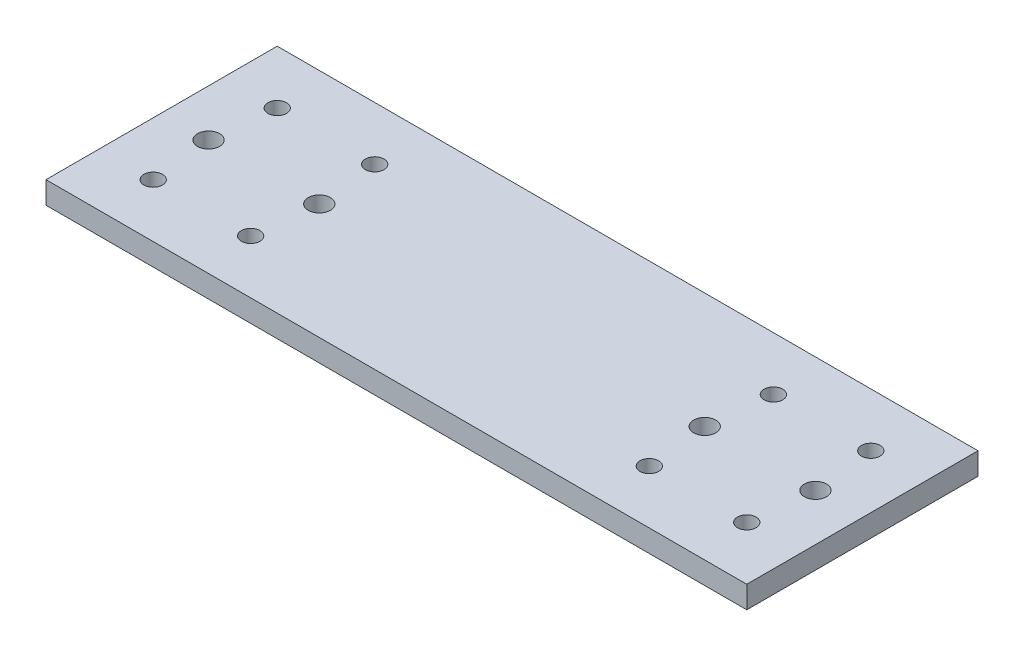
ISO-10303-21;
HEADER;
FILE_DESCRIPTION(('STEP AP214'),'2;1');
FILE_NAME('part.step','',(''),(''),'','','');
FILE_SCHEMA(('AUTOMOTIVE_DESIGN { 1 0 10303 214 1 1 1 1 }'));
ENDSEC;
DATA;
#1=APPLICATION_CONTEXT('core data for automotive mechanical design processes');
#2=APPLICATION_PROTOCOL_DEFINITION('international standard','automotive_design',2000,#1);
#3=PRODUCT_CONTEXT('',#1,'mechanical');
#4=PRODUCT('Part','Part','',(#3));
#5=PRODUCT_RELATED_PRODUCT_CATEGORY('part','',(#4));
#6=PRODUCT_DEFINITION_FORMATION('','',#4);
#7=PRODUCT_DEFINITION_CONTEXT('part definition',#1,'design');
#8=PRODUCT_DEFINITION('design','',#6,#7);
#9=PRODUCT_DEFINITION_SHAPE('','',#8);
#10=(LENGTH_UNIT() NAMED_UNIT(*) SI_UNIT(.MILLI.,.METRE.));
#11=(NAMED_UNIT(*) PLANE_ANGLE_UNIT() SI_UNIT($,.RADIAN.));
#12=(NAMED_UNIT(*) SI_UNIT($,.STERADIAN.) SOLID_ANGLE_UNIT());
#13=UNCERTAINTY_MEASURE_WITH_UNIT(LENGTH_MEASURE(1.E-05),#10,'distance_accuracy_value','');
#14=(GEOMETRIC_REPRESENTATION_CONTEXT(3) GLOBAL_UNCERTAINTY_ASSIGNED_CONTEXT((#13)) GLOBAL_UNIT_ASSIGNED_CONTEXT((#10,
#11,#12)) REPRESENTATION_CONTEXT('',''));
#15=CARTESIAN_POINT('',(0.,0.,0.));
#16=DIRECTION('',(0.,0.,1.));
#17=DIRECTION('',(1.,0.,0.));
#18=AXIS2_PLACEMENT_3D('',#15,#16,#17);
#19=CARTESIAN_POINT('',(0.,5.,0.));
#20=DIRECTION('',(0.,1.,0.));
#21=DIRECTION('',(0.,0.,1.));
#22=AXIS2_PLACEMENT_3D('',#19,#20,#21);
#23=PLANE('',#22);
#24=CARTESIAN_POINT('',(99.5000003054737,5.,-1.59594559789866E-13));
#25=DIRECTION('',(0.,-1.,0.));
#26=DIRECTION('',(0.,0.,-1.));
#27=AXIS2_PLACEMENT_3D('',#24,#25,#26);
#28=CIRCLE('',#27,2.50000000000003);
#29=CARTESIAN_POINT('',(99.5000003054737,5.,-2.50000000000019));
#30=VERTEX_POINT('',#29);
#31=EDGE_CURVE('E310',#30,#30,#28,.T.);
#32=ORIENTED_EDGE('',*,*,#31,.T.);
#33=EDGE_LOOP('',(#32));
#34=FACE_BOUND('',#33,.T.);
#35=CARTESIAN_POINT('',(-12.5,5.,1.31838984174237E-13));
#36=DIRECTION('',(0.,1.,0.));
#37=DIRECTION('',(0.,0.,1.));
#38=AXIS2_PLACEMENT_3D('',#35,#36,#37);
#39=CIRCLE('',#38,2.49999999999991);
#40=CARTESIAN_POINT('',(-12.5,5.,2.50000000000004));
#41=VERTEX_POINT('',#40);
#42=EDGE_CURVE('E305',#41,#41,#39,.T.);
#43=ORIENTED_EDGE('',*,*,#42,.F.);
#44=EDGE_LOOP('',(#43));
#45=FACE_BOUND('',#44,.T.);
#46=CARTESIAN_POINT('',(12.5,5.,-1.59594559789866E-13));
#47=DIRECTION('',(0.,1.,0.));
#48=DIRECTION('',(0.,0.,1.));
#49=AXIS2_PLACEMENT_3D('',#46,#47,#48);
#50=CIRCLE('',#49,2.50000000000003);
#51=CARTESIAN_POINT('',(12.5,5.,2.49999999999987));
#52=VERTEX_POINT('',#51);
#53=EDGE_CURVE('E181',#52,#52,#50,.T.);
#54=ORIENTED_EDGE('',*,*,#53,.F.);
#55=EDGE_LOOP('',(#54));
#56=FACE_BOUND('',#55,.T.);
#57=CARTESIAN_POINT('',(101.000000305474,5.,-14.));
#58=DIRECTION('',(0.,1.,0.));
#59=DIRECTION('',(0.,0.,1.));
#60=AXIS2_PLACEMENT_3D('',#57,#58,#59);
#61=CIRCLE('',#60,2.10000000000002);
#62=CARTESIAN_POINT('',(101.000000305474,5.,-11.9));
#63=VERTEX_POINT('',#62);
#64=EDGE_CURVE('E171',#63,#63,#61,.F.);
#65=ORIENTED_EDGE('',*,*,#64,.T.);
#66=EDGE_LOOP('',(#65));
#67=FACE_BOUND('',#66,.T.);
#68=CARTESIAN_POINT('',(123.000000305474,5.,14.));
#69=DIRECTION('',(0.,1.,0.));
#70=DIRECTION('',(0.,0.,1.));
#71=AXIS2_PLACEMENT_3D('',#68,#69,#70);
#72=CIRCLE('',#71,2.09999999999998);
#73=CARTESIAN_POINT('',(123.000000305474,5.,16.1));
#74=VERTEX_POINT('',#73);
#75=EDGE_CURVE('E253',#74,#74,#72,.F.);
#76=ORIENTED_EDGE('',*,*,#75,.T.);
#77=EDGE_LOOP('',(#76));
#78=FACE_BOUND('',#77,.T.);
#79=CARTESIAN_POINT('',(-11.,5.,14.));
#80=DIRECTION('',(0.,1.,0.));
#81=DIRECTION('',(0.,0.,1.));
#82=AXIS2_PLACEMENT_3D('',#79,#80,#81);
#83=CIRCLE('',#82,2.1);
#84=CARTESIAN_POINT('',(-11.,5.,16.1));
#85=VERTEX_POINT('',#84);
#86=EDGE_CURVE('E277',#85,#85,#83,.T.);
#87=ORIENTED_EDGE('',*,*,#86,.F.);
#88=EDGE_LOOP('',(#87));
#89=FACE_BOUND('',#88,.T.);
#90=CARTESIAN_POINT('',(11.,5.,14.));
#91=DIRECTION('',(0.,1.,0.));
#92=DIRECTION('',(0.,0.,1.));
#93=AXIS2_PLACEMENT_3D('',#90,#91,#92);
#94=CIRCLE('',#93,2.1);
#95=CARTESIAN_POINT('',(11.,5.,16.1));
#96=VERTEX_POINT('',#95);
#97=EDGE_CURVE('E282',#96,#96,#94,.T.);
#98=ORIENTED_EDGE('',*,*,#97,.F.);
#99=EDGE_LOOP('',(#98));
#100=FACE_BOUND('',#99,.T.);
#101=CARTESIAN_POINT('',(11.,5.,-14.));
#102=DIRECTION('',(0.,1.,0.));
#103=DIRECTION('',(0.,0.,1.));
#104=AXIS2_PLACEMENT_3D('',#101,#102,#103);
#105=CIRCLE('',#104,2.1);
#106=CARTESIAN_POINT('',(11.,5.,-11.9));
#107=VERTEX_POINT('',#106);
#108=EDGE_CURVE('E291',#107,#107,#105,.T.);
#109=ORIENTED_EDGE('',*,*,#108,.F.);
#110=EDGE_LOOP('',(#109));
#111=FACE_BOUND('',#110,.T.);
#112=CARTESIAN_POINT('',(-11.,5.,-14.));
#113=DIRECTION('',(0.,1.,0.));
#114=DIRECTION('',(0.,0.,1.));
#115=AXIS2_PLACEMENT_3D('',#112,#113,#114);
#116=CIRCLE('',#115,2.1);
#117=CARTESIAN_POINT('',(-11.,5.,-11.9));
#118=VERTEX_POINT('',#117);
#119=EDGE_CURVE('E115',#118,#118,#116,.T.);
#120=ORIENTED_EDGE('',*,*,#119,.F.);
#121=EDGE_LOOP('',(#120));
#122=FACE_BOUND('',#121,.T.);
#123=DIRECTION('',(0.,0.,1.));
#124=VECTOR('',#123,1.);
#125=CARTESIAN_POINT('',(135.100000305474,5.,0.));
#126=LINE('',#125,#124);
#127=CARTESIAN_POINT('',(135.100000305474,5.,-26.1));
#128=VERTEX_POINT('',#127);
#129=CARTESIAN_POINT('',(135.100000305474,5.,26.1));
#130=VERTEX_POINT('',#129);
#131=EDGE_CURVE('E111',#128,#130,#126,.T.);
#132=ORIENTED_EDGE('',*,*,#131,.F.);
#133=DIRECTION('',(1.,0.,0.));
#134=VECTOR('',#133,1.);
#135=CARTESIAN_POINT('',(0.,5.,-26.1));
#136=LINE('',#135,#134);
#137=CARTESIAN_POINT('',(-23.1,5.,-26.1));
#138=VERTEX_POINT('',#137);
#139=EDGE_CURVE('E97',#138,#128,#136,.T.);
#140=ORIENTED_EDGE('',*,*,#139,.F.);
#141=DIRECTION('',(0.,0.,1.));
#142=VECTOR('',#141,1.);
#143=CARTESIAN_POINT('',(-23.1,5.,0.));
#144=LINE('',#143,#142);
#145=CARTESIAN_POINT('',(-23.1,5.,26.1));
#146=VERTEX_POINT('',#145);
#147=EDGE_CURVE('E106',#138,#146,#144,.T.);
#148=ORIENTED_EDGE('',*,*,#147,.T.);
#149=DIRECTION('',(1.,0.,0.));
#150=VECTOR('',#149,1.);
#151=CARTESIAN_POINT('',(0.,5.,26.1));
#152=LINE('',#151,#150);
#153=EDGE_CURVE('E64',#146,#130,#152,.T.);
#154=ORIENTED_EDGE('',*,*,#153,.T.);
#155=EDGE_LOOP('',(#132,#140,#148,#154));
#156=FACE_BOUND('',#155,.T.);
#157=CARTESIAN_POINT('',(101.000000305474,5.,14.));
#158=DIRECTION('',(0.,1.,0.));
#159=DIRECTION('',(0.,0.,1.));
#160=AXIS2_PLACEMENT_3D('',#157,#158,#159);
#161=CIRCLE('',#160,2.1);
#162=CARTESIAN_POINT('',(101.000000305474,5.,16.1));
#163=VERTEX_POINT('',#162);
#164=EDGE_CURVE('E121',#163,#163,#161,.F.);
#165=ORIENTED_EDGE('',*,*,#164,.T.);
#166=EDGE_LOOP('',(#165));
#167=FACE_BOUND('',#166,.T.);
#168=CARTESIAN_POINT('',(123.000000305474,5.,-14.));
#169=DIRECTION('',(0.,1.,0.));
#170=DIRECTION('',(0.,0.,1.));
#171=AXIS2_PLACEMENT_3D('',#168,#169,#170);
#172=CIRCLE('',#171,2.09999999999998);
#173=CARTESIAN_POINT('',(123.000000305474,5.,-11.9));
#174=VERTEX_POINT('',#173);
#175=EDGE_CURVE('E125',#174,#174,#172,.F.);
#176=ORIENTED_EDGE('',*,*,#175,.T.);
#177=EDGE_LOOP('',(#176));
#178=FACE_BOUND('',#177,.T.);
#179=CARTESIAN_POINT('',(124.500000305474,5.,1.31838984174237E-13));
#180=DIRECTION('',(0.,-1.,0.));
#181=DIRECTION('',(0.,0.,-1.));
#182=AXIS2_PLACEMENT_3D('',#179,#180,#181);
#183=CIRCLE('',#182,2.49999999999991);
#184=CARTESIAN_POINT('',(124.500000305474,5.,-2.49999999999978));
#185=VERTEX_POINT('',#184);
#186=EDGE_CURVE('E306',#185,#185,#183,.T.);
#187=ORIENTED_EDGE('',*,*,#186,.T.);
#188=EDGE_LOOP('',(#187));
#189=FACE_BOUND('',#188,.T.);
#190=ADVANCED_FACE('F44',(#34,#45,#56,#67,#78,#89,#100,#111,#122,#156,#167,#178,#189),#23,.T.);
#191=CARTESIAN_POINT('',(0.,0.,0.));
#192=DIRECTION('',(0.,1.,0.));
#193=DIRECTION('',(0.,0.,1.));
#194=AXIS2_PLACEMENT_3D('',#191,#192,#193);
#195=PLANE('',#194);
#196=CARTESIAN_POINT('',(-12.5,0.,1.31838984174237E-13));
#197=DIRECTION('',(0.,1.,0.));
#198=DIRECTION('',(0.,0.,1.));
#199=AXIS2_PLACEMENT_3D('',#196,#197,#198);
#200=CIRCLE('',#199,2.49999999999991);
#201=CARTESIAN_POINT('',(-12.5,0.,2.50000000000004));
#202=VERTEX_POINT('',#201);
#203=EDGE_CURVE('E180',#202,#202,#200,.T.);
#204=ORIENTED_EDGE('',*,*,#203,.T.);
#205=EDGE_LOOP('',(#204));
#206=FACE_BOUND('',#205,.T.);
#207=CARTESIAN_POINT('',(12.5,0.,-1.59594559789866E-13));
#208=DIRECTION('',(0.,1.,0.));
#209=DIRECTION('',(0.,0.,1.));
#210=AXIS2_PLACEMENT_3D('',#207,#208,#209);
#211=CIRCLE('',#210,2.50000000000003);
#212=CARTESIAN_POINT('',(12.5,0.,2.49999999999987));
#213=VERTEX_POINT('',#212);
#214=EDGE_CURVE('E176',#213,#213,#211,.T.);
#215=ORIENTED_EDGE('',*,*,#214,.T.);
#216=EDGE_LOOP('',(#215));
#217=FACE_BOUND('',#216,.T.);
#218=CARTESIAN_POINT('',(101.000000305474,0.,-14.));
#219=DIRECTION('',(0.,1.,0.));
#220=DIRECTION('',(0.,0.,1.));
#221=AXIS2_PLACEMENT_3D('',#218,#219,#220);
#222=CIRCLE('',#221,2.10000000000002);
#223=CARTESIAN_POINT('',(101.000000305474,0.,-11.9));
#224=VERTEX_POINT('',#223);
#225=EDGE_CURVE('E129',#224,#224,#222,.F.);
#226=ORIENTED_EDGE('',*,*,#225,.F.);
#227=EDGE_LOOP('',(#226));
#228=FACE_BOUND('',#227,.T.);
#229=CARTESIAN_POINT('',(123.000000305474,0.,14.));
#230=DIRECTION('',(0.,1.,0.));
#231=DIRECTION('',(0.,0.,1.));
#232=AXIS2_PLACEMENT_3D('',#229,#230,#231);
#233=CIRCLE('',#232,2.09999999999998);
#234=CARTESIAN_POINT('',(123.000000305474,0.,16.1));
#235=VERTEX_POINT('',#234);
#236=EDGE_CURVE('E133',#235,#235,#233,.F.);
#237=ORIENTED_EDGE('',*,*,#236,.F.);
#238=EDGE_LOOP('',(#237));
#239=FACE_BOUND('',#238,.T.);
#240=CARTESIAN_POINT('',(-11.,0.,14.));
#241=DIRECTION('',(0.,1.,0.));
#242=DIRECTION('',(0.,0.,1.));
#243=AXIS2_PLACEMENT_3D('',#240,#241,#242);
#244=CIRCLE('',#243,2.1);
#245=CARTESIAN_POINT('',(-11.,0.,16.1));
#246=VERTEX_POINT('',#245);
#247=EDGE_CURVE('E137',#246,#246,#244,.T.);
#248=ORIENTED_EDGE('',*,*,#247,.T.);
#249=EDGE_LOOP('',(#248));
#250=FACE_BOUND('',#249,.T.);
#251=CARTESIAN_POINT('',(11.,0.,14.));
#252=DIRECTION('',(0.,1.,0.));
#253=DIRECTION('',(0.,0.,1.));
#254=AXIS2_PLACEMENT_3D('',#251,#252,#253);
#255=CIRCLE('',#254,2.1);
#256=CARTESIAN_POINT('',(11.,0.,16.1));
#257=VERTEX_POINT('',#256);
#258=EDGE_CURVE('E141',#257,#257,#255,.T.);
#259=ORIENTED_EDGE('',*,*,#258,.T.);
#260=EDGE_LOOP('',(#259));
#261=FACE_BOUND('',#260,.T.);
#262=CARTESIAN_POINT('',(11.,0.,-14.));
#263=DIRECTION('',(0.,1.,0.));
#264=DIRECTION('',(0.,0.,1.));
#265=AXIS2_PLACEMENT_3D('',#262,#263,#264);
#266=CIRCLE('',#265,2.1);
#267=CARTESIAN_POINT('',(11.,0.,-11.9));
#268=VERTEX_POINT('',#267);
#269=EDGE_CURVE('E145',#268,#268,#266,.T.);
#270=ORIENTED_EDGE('',*,*,#269,.T.);
#271=EDGE_LOOP('',(#270));
#272=FACE_BOUND('',#271,.T.);
#273=CARTESIAN_POINT('',(-11.,0.,-14.));
#274=DIRECTION('',(0.,1.,0.));
#275=DIRECTION('',(0.,0.,1.));
#276=AXIS2_PLACEMENT_3D('',#273,#274,#275);
#277=CIRCLE('',#276,2.1);
#278=CARTESIAN_POINT('',(-11.,0.,-11.9));
#279=VERTEX_POINT('',#278);
#280=EDGE_CURVE('E149',#279,#279,#277,.T.);
#281=ORIENTED_EDGE('',*,*,#280,.T.);
#282=EDGE_LOOP('',(#281));
#283=FACE_BOUND('',#282,.T.);
#284=DIRECTION('',(0.,0.,1.));
#285=VECTOR('',#284,1.);
#286=CARTESIAN_POINT('',(135.100000305474,0.,0.));
#287=LINE('',#286,#285);
#288=CARTESIAN_POINT('',(135.100000305474,0.,-26.1));
#289=VERTEX_POINT('',#288);
#290=CARTESIAN_POINT('',(135.100000305474,0.,26.1));
#291=VERTEX_POINT('',#290);
#292=EDGE_CURVE('E153',#289,#291,#287,.T.);
#293=ORIENTED_EDGE('',*,*,#292,.T.);
#294=DIRECTION('',(1.,0.,0.));
#295=VECTOR('',#294,1.);
#296=CARTESIAN_POINT('',(0.,0.,26.1));
#297=LINE('',#296,#295);
#298=CARTESIAN_POINT('',(-23.1,0.,26.1));
#299=VERTEX_POINT('',#298);
#300=EDGE_CURVE('E80',#299,#291,#297,.T.);
#301=ORIENTED_EDGE('',*,*,#300,.F.);
#302=DIRECTION('',(0.,0.,1.));
#303=VECTOR('',#302,1.);
#304=CARTESIAN_POINT('',(-23.1,0.,0.));
#305=LINE('',#304,#303);
#306=CARTESIAN_POINT('',(-23.1,0.,-26.1));
#307=VERTEX_POINT('',#306);
#308=EDGE_CURVE('E158',#307,#299,#305,.T.);
#309=ORIENTED_EDGE('',*,*,#308,.F.);
#310=DIRECTION('',(1.,0.,0.));
#311=VECTOR('',#310,1.);
#312=CARTESIAN_POINT('',(0.,0.,-26.1));
#313=LINE('',#312,#311);
#314=EDGE_CURVE('E99',#307,#289,#313,.T.);
#315=ORIENTED_EDGE('',*,*,#314,.T.);
#316=EDGE_LOOP('',(#293,#301,#309,#315));
#317=FACE_BOUND('',#316,.T.);
#318=CARTESIAN_POINT('',(101.000000305474,0.,14.));
#319=DIRECTION('',(0.,1.,0.));
#320=DIRECTION('',(0.,0.,1.));
#321=AXIS2_PLACEMENT_3D('',#318,#319,#320);
#322=CIRCLE('',#321,2.1);
#323=CARTESIAN_POINT('',(101.000000305474,0.,16.1));
#324=VERTEX_POINT('',#323);
#325=EDGE_CURVE('E163',#324,#324,#322,.F.);
#326=ORIENTED_EDGE('',*,*,#325,.F.);
#327=EDGE_LOOP('',(#326));
#328=FACE_BOUND('',#327,.T.);
#329=CARTESIAN_POINT('',(123.000000305474,0.,-14.));
#330=DIRECTION('',(0.,1.,0.));
#331=DIRECTION('',(0.,0.,1.));
#332=AXIS2_PLACEMENT_3D('',#329,#330,#331);
#333=CIRCLE('',#332,2.09999999999998);
#334=CARTESIAN_POINT('',(123.000000305474,0.,-11.9));
#335=VERTEX_POINT('',#334);
#336=EDGE_CURVE('E167',#335,#335,#333,.F.);
#337=ORIENTED_EDGE('',*,*,#336,.F.);
#338=EDGE_LOOP('',(#337));
#339=FACE_BOUND('',#338,.T.);
#340=CARTESIAN_POINT('',(99.5000003054737,0.,-1.59594559789866E-13));
#341=DIRECTION('',(0.,1.,0.));
#342=DIRECTION('',(0.,0.,1.));
#343=AXIS2_PLACEMENT_3D('',#340,#341,#342);
#344=CIRCLE('',#343,2.50000000000003);
#345=CARTESIAN_POINT('',(99.5000003054737,0.,2.49999999999987));
#346=VERTEX_POINT('',#345);
#347=EDGE_CURVE('E184',#346,#346,#344,.F.);
#348=ORIENTED_EDGE('',*,*,#347,.F.);
#349=EDGE_LOOP('',(#348));
#350=FACE_BOUND('',#349,.T.);
#351=CARTESIAN_POINT('',(124.500000305474,0.,1.31838984174237E-13));
#352=DIRECTION('',(0.,1.,0.));
#353=DIRECTION('',(0.,0.,1.));
#354=AXIS2_PLACEMENT_3D('',#351,#352,#353);
#355=CIRCLE('',#354,2.49999999999991);
#356=CARTESIAN_POINT('',(124.500000305474,0.,2.50000000000004));
#357=VERTEX_POINT('',#356);
#358=EDGE_CURVE('E48',#357,#357,#355,.F.);
#359=ORIENTED_EDGE('',*,*,#358,.F.);
#360=EDGE_LOOP('',(#359));
#361=FACE_BOUND('',#360,.T.);
#362=ADVANCED_FACE('F195',(#206,#217,#228,#239,#250,#261,#272,#283,#317,#328,#339,#350,#361),
#195,.F.);
#363=CARTESIAN_POINT('',(135.100000305474,5.,0.));
#364=DIRECTION('',(1.,0.,0.));
#365=DIRECTION('',(0.,0.,-1.));
#366=AXIS2_PLACEMENT_3D('',#363,#364,#365);
#367=PLANE('',#366);
#368=ORIENTED_EDGE('',*,*,#292,.F.);
#369=DIRECTION('',(0.,-1.,0.));
#370=VECTOR('',#369,1.);
#371=CARTESIAN_POINT('',(135.100000305474,5.,-26.1));
#372=LINE('',#371,#370);
#373=EDGE_CURVE('E11',#128,#289,#372,.T.);
#374=ORIENTED_EDGE('',*,*,#373,.F.);
#375=ORIENTED_EDGE('',*,*,#131,.T.);
#376=DIRECTION('',(0.,-1.,0.));
#377=VECTOR('',#376,1.);
#378=CARTESIAN_POINT('',(135.100000305474,5.,26.1));
#379=LINE('',#378,#377);
#380=EDGE_CURVE('E87',#130,#291,#379,.T.);
#381=ORIENTED_EDGE('',*,*,#380,.T.);
#382=EDGE_LOOP('',(#368,#374,#375,#381));
#383=FACE_BOUND('',#382,.T.);
#384=ADVANCED_FACE('F197',(#383),#367,.T.);
#385=CARTESIAN_POINT('',(0.,5.,-26.1));
#386=DIRECTION('',(0.,0.,-1.));
#387=DIRECTION('',(-1.,0.,0.));
#388=AXIS2_PLACEMENT_3D('',#385,#386,#387);
#389=PLANE('',#388);
#390=ORIENTED_EDGE('',*,*,#314,.F.);
#391=DIRECTION('',(0.,-1.,0.));
#392=VECTOR('',#391,1.);
#393=CARTESIAN_POINT('',(-23.1,5.,-26.1));
#394=LINE('',#393,#392);
#395=EDGE_CURVE('E55',#138,#307,#394,.T.);
#396=ORIENTED_EDGE('',*,*,#395,.F.);
#397=ORIENTED_EDGE('',*,*,#139,.T.);
#398=ORIENTED_EDGE('',*,*,#373,.T.);
#399=EDGE_LOOP('',(#390,#396,#397,#398));
#400=FACE_BOUND('',#399,.T.);
#401=ADVANCED_FACE('F95',(#400),#389,.T.);
#402=CARTESIAN_POINT('',(-23.1,5.,0.));
#403=DIRECTION('',(1.,0.,0.));
#404=DIRECTION('',(0.,0.,-1.));
#405=AXIS2_PLACEMENT_3D('',#402,#403,#404);
#406=PLANE('',#405);
#407=ORIENTED_EDGE('',*,*,#308,.T.);
#408=DIRECTION('',(0.,-1.,0.));
#409=VECTOR('',#408,1.);
#410=CARTESIAN_POINT('',(-23.1,5.,26.1));
#411=LINE('',#410,#409);
#412=EDGE_CURVE('E103',#146,#299,#411,.T.);
#413=ORIENTED_EDGE('',*,*,#412,.F.);
#414=ORIENTED_EDGE('',*,*,#147,.F.);
#415=ORIENTED_EDGE('',*,*,#395,.T.);
#416=EDGE_LOOP('',(#407,#413,#414,#415));
#417=FACE_BOUND('',#416,.T.);
#418=ADVANCED_FACE('F107',(#417),#406,.F.);
#419=CARTESIAN_POINT('',(101.000000305474,5.,14.));
#420=DIRECTION('',(0.,-1.,0.));
#421=DIRECTION('',(0.,0.,-1.));
#422=AXIS2_PLACEMENT_3D('',#419,#420,#421);
#423=CYLINDRICAL_SURFACE('',#422,2.1);
#424=ORIENTED_EDGE('',*,*,#164,.F.);
#425=EDGE_LOOP('',(#424));
#426=FACE_BOUND('',#425,.T.);
#427=ORIENTED_EDGE('',*,*,#325,.T.);
#428=EDGE_LOOP('',(#427));
#429=FACE_BOUND('',#428,.T.);
#430=ADVANCED_FACE('F216',(#426,#429),#423,.F.);
#431=CARTESIAN_POINT('',(0.,5.,26.1));
#432=DIRECTION('',(0.,0.,-1.));
#433=DIRECTION('',(-1.,0.,0.));
#434=AXIS2_PLACEMENT_3D('',#431,#432,#433);
#435=PLANE('',#434);
#436=ORIENTED_EDGE('',*,*,#300,.T.);
#437=ORIENTED_EDGE('',*,*,#380,.F.);
#438=ORIENTED_EDGE('',*,*,#153,.F.);
#439=ORIENTED_EDGE('',*,*,#412,.T.);
#440=EDGE_LOOP('',(#436,#437,#438,#439));
#441=FACE_BOUND('',#440,.T.);
#442=ADVANCED_FACE('F219',(#441),#435,.F.);
#443=CARTESIAN_POINT('',(-11.,5.,-14.));
#444=DIRECTION('',(0.,-1.,0.));
#445=DIRECTION('',(0.,0.,-1.));
#446=AXIS2_PLACEMENT_3D('',#443,#444,#445);
#447=CYLINDRICAL_SURFACE('',#446,2.1);
#448=ORIENTED_EDGE('',*,*,#119,.T.);
#449=EDGE_LOOP('',(#448));
#450=FACE_BOUND('',#449,.T.);
#451=ORIENTED_EDGE('',*,*,#280,.F.);
#452=EDGE_LOOP('',(#451));
#453=FACE_BOUND('',#452,.T.);
#454=ADVANCED_FACE('F223',(#450,#453),#447,.F.);
#455=CARTESIAN_POINT('',(11.,5.,-14.));
#456=DIRECTION('',(0.,-1.,0.));
#457=DIRECTION('',(0.,0.,-1.));
#458=AXIS2_PLACEMENT_3D('',#455,#456,#457);
#459=CYLINDRICAL_SURFACE('',#458,2.1);
#460=ORIENTED_EDGE('',*,*,#108,.T.);
#461=EDGE_LOOP('',(#460));
#462=FACE_BOUND('',#461,.T.);
#463=ORIENTED_EDGE('',*,*,#269,.F.);
#464=EDGE_LOOP('',(#463));
#465=FACE_BOUND('',#464,.T.);
#466=ADVANCED_FACE('F231',(#462,#465),#459,.F.);
#467=CARTESIAN_POINT('',(11.,5.,14.));
#468=DIRECTION('',(0.,-1.,0.));
#469=DIRECTION('',(0.,0.,-1.));
#470=AXIS2_PLACEMENT_3D('',#467,#468,#469);
#471=CYLINDRICAL_SURFACE('',#470,2.1);
#472=ORIENTED_EDGE('',*,*,#97,.T.);
#473=EDGE_LOOP('',(#472));
#474=FACE_BOUND('',#473,.T.);
#475=ORIENTED_EDGE('',*,*,#258,.F.);
#476=EDGE_LOOP('',(#475));
#477=FACE_BOUND('',#476,.T.);
#478=ADVANCED_FACE('F235',(#474,#477),#471,.F.);
#479=CARTESIAN_POINT('',(-11.,5.,14.));
#480=DIRECTION('',(0.,-1.,0.));
#481=DIRECTION('',(0.,0.,-1.));
#482=AXIS2_PLACEMENT_3D('',#479,#480,#481);
#483=CYLINDRICAL_SURFACE('',#482,2.1);
#484=ORIENTED_EDGE('',*,*,#86,.T.);
#485=EDGE_LOOP('',(#484));
#486=FACE_BOUND('',#485,.T.);
#487=ORIENTED_EDGE('',*,*,#247,.F.);
#488=EDGE_LOOP('',(#487));
#489=FACE_BOUND('',#488,.T.);
#490=ADVANCED_FACE('F239',(#486,#489),#483,.F.);
#491=CARTESIAN_POINT('',(123.000000305474,5.,14.));
#492=DIRECTION('',(0.,-1.,0.));
#493=DIRECTION('',(0.,0.,-1.));
#494=AXIS2_PLACEMENT_3D('',#491,#492,#493);
#495=CYLINDRICAL_SURFACE('',#494,2.09999999999998);
#496=ORIENTED_EDGE('',*,*,#75,.F.);
#497=EDGE_LOOP('',(#496));
#498=FACE_BOUND('',#497,.T.);
#499=ORIENTED_EDGE('',*,*,#236,.T.);
#500=EDGE_LOOP('',(#499));
#501=FACE_BOUND('',#500,.T.);
#502=ADVANCED_FACE('F242',(#498,#501),#495,.F.);
#503=CARTESIAN_POINT('',(101.000000305474,5.,-14.));
#504=DIRECTION('',(0.,-1.,0.));
#505=DIRECTION('',(0.,0.,-1.));
#506=AXIS2_PLACEMENT_3D('',#503,#504,#505);
#507=CYLINDRICAL_SURFACE('',#506,2.10000000000002);
#508=ORIENTED_EDGE('',*,*,#64,.F.);
#509=EDGE_LOOP('',(#508));
#510=FACE_BOUND('',#509,.T.);
#511=ORIENTED_EDGE('',*,*,#225,.T.);
#512=EDGE_LOOP('',(#511));
#513=FACE_BOUND('',#512,.T.);
#514=ADVANCED_FACE('F46',(#510,#513),#507,.F.);
#515=CARTESIAN_POINT('',(123.000000305474,5.,-14.));
#516=DIRECTION('',(0.,-1.,0.));
#517=DIRECTION('',(0.,0.,-1.));
#518=AXIS2_PLACEMENT_3D('',#515,#516,#517);
#519=CYLINDRICAL_SURFACE('',#518,2.09999999999998);
#520=ORIENTED_EDGE('',*,*,#175,.F.);
#521=EDGE_LOOP('',(#520));
#522=FACE_BOUND('',#521,.T.);
#523=ORIENTED_EDGE('',*,*,#336,.T.);
#524=EDGE_LOOP('',(#523));
#525=FACE_BOUND('',#524,.T.);
#526=ADVANCED_FACE('F211',(#522,#525),#519,.F.);
#527=CARTESIAN_POINT('',(12.5,-5.,-1.59594559789866E-13));
#528=DIRECTION('',(0.,1.,0.));
#529=DIRECTION('',(0.,0.,1.));
#530=AXIS2_PLACEMENT_3D('',#527,#528,#529);
#531=CYLINDRICAL_SURFACE('',#530,2.50000000000003);
#532=ORIENTED_EDGE('',*,*,#53,.T.);
#533=EDGE_LOOP('',(#532));
#534=FACE_BOUND('',#533,.T.);
#535=ORIENTED_EDGE('',*,*,#214,.F.);
#536=EDGE_LOOP('',(#535));
#537=FACE_BOUND('',#536,.T.);
#538=ADVANCED_FACE('F214',(#534,#537),#531,.F.);
#539=CARTESIAN_POINT('',(-12.5,-5.,1.31838984174237E-13));
#540=DIRECTION('',(0.,1.,0.));
#541=DIRECTION('',(0.,0.,1.));
#542=AXIS2_PLACEMENT_3D('',#539,#540,#541);
#543=CYLINDRICAL_SURFACE('',#542,2.49999999999991);
#544=ORIENTED_EDGE('',*,*,#42,.T.);
#545=EDGE_LOOP('',(#544));
#546=FACE_BOUND('',#545,.T.);
#547=ORIENTED_EDGE('',*,*,#203,.F.);
#548=EDGE_LOOP('',(#547));
#549=FACE_BOUND('',#548,.T.);
#550=ADVANCED_FACE('F318',(#546,#549),#543,.F.);
#551=CARTESIAN_POINT('',(99.5000003054737,-5.,-1.59594559789866E-13));
#552=DIRECTION('',(0.,1.,0.));
#553=DIRECTION('',(0.,0.,1.));
#554=AXIS2_PLACEMENT_3D('',#551,#552,#553);
#555=CYLINDRICAL_SURFACE('',#554,2.50000000000003);
#556=ORIENTED_EDGE('',*,*,#31,.F.);
#557=EDGE_LOOP('',(#556));
#558=FACE_BOUND('',#557,.T.);
#559=ORIENTED_EDGE('',*,*,#347,.T.);
#560=EDGE_LOOP('',(#559));
#561=FACE_BOUND('',#560,.T.);
#562=ADVANCED_FACE('F337',(#558,#561),#555,.F.);
#563=CARTESIAN_POINT('',(124.500000305474,-5.,1.31838984174237E-13));
#564=DIRECTION('',(0.,1.,0.));
#565=DIRECTION('',(0.,0.,1.));
#566=AXIS2_PLACEMENT_3D('',#563,#564,#565);
#567=CYLINDRICAL_SURFACE('',#566,2.49999999999991);
#568=ORIENTED_EDGE('',*,*,#186,.F.);
#569=EDGE_LOOP('',(#568));
#570=FACE_BOUND('',#569,.T.);
#571=ORIENTED_EDGE('',*,*,#358,.T.);
#572=EDGE_LOOP('',(#571));
#573=FACE_BOUND('',#572,.T.);
#574=ADVANCED_FACE('F193',(#570,#573),#567,.F.);
#575=CLOSED_SHELL('',(#190,#362,#384,#401,#418,#430,#442,#454,#466,#478,#490,#502,#514,#526,
#538,#550,#562,#574));
#576=MANIFOLD_SOLID_BREP('B2',#575);
#577=ADVANCED_BREP_SHAPE_REPRESENTATION('',(#18,#576),#14);
#578=SHAPE_DEFINITION_REPRESENTATION(#9,#577);
ENDSEC;
END-ISO-10303-21;
